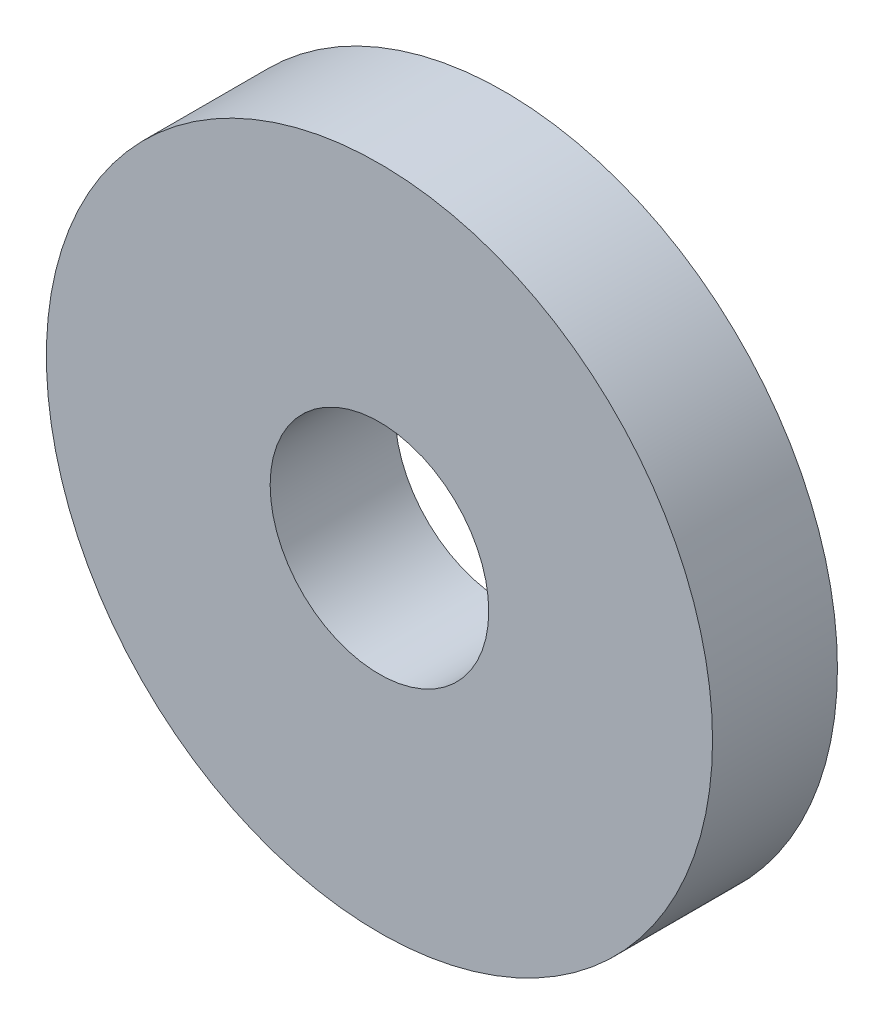
ISO-10303-21;
HEADER;
FILE_DESCRIPTION(('STEP AP214'),'2;1');
FILE_NAME('part.step','',(''),(''),'','','');
FILE_SCHEMA(('AUTOMOTIVE_DESIGN { 1 0 10303 214 1 1 1 1 }'));
ENDSEC;
DATA;
#1=APPLICATION_CONTEXT('core data for automotive mechanical design processes');
#2=APPLICATION_PROTOCOL_DEFINITION('international standard','automotive_design',2000,#1);
#3=PRODUCT_CONTEXT('',#1,'mechanical');
#4=PRODUCT('Part','Part','',(#3));
#5=PRODUCT_RELATED_PRODUCT_CATEGORY('part','',(#4));
#6=PRODUCT_DEFINITION_FORMATION('','',#4);
#7=PRODUCT_DEFINITION_CONTEXT('part definition',#1,'design');
#8=PRODUCT_DEFINITION('design','',#6,#7);
#9=PRODUCT_DEFINITION_SHAPE('','',#8);
#10=(LENGTH_UNIT() NAMED_UNIT(*) SI_UNIT(.MILLI.,.METRE.));
#11=(NAMED_UNIT(*) PLANE_ANGLE_UNIT() SI_UNIT($,.RADIAN.));
#12=(NAMED_UNIT(*) SI_UNIT($,.STERADIAN.) SOLID_ANGLE_UNIT());
#13=UNCERTAINTY_MEASURE_WITH_UNIT(LENGTH_MEASURE(1.E-05),#10,'distance_accuracy_value','');
#14=(GEOMETRIC_REPRESENTATION_CONTEXT(3) GLOBAL_UNCERTAINTY_ASSIGNED_CONTEXT((#13)) GLOBAL_UNIT_ASSIGNED_CONTEXT((#10,
#11,#12)) REPRESENTATION_CONTEXT('',''));
#15=CARTESIAN_POINT('',(0.,0.,0.));
#16=DIRECTION('',(0.,0.,1.));
#17=DIRECTION('',(1.,0.,0.));
#18=AXIS2_PLACEMENT_3D('',#15,#16,#17);
#19=CARTESIAN_POINT('',(0.,0.,6.));
#20=DIRECTION('',(0.,0.,1.));
#21=DIRECTION('',(1.,0.,0.));
#22=AXIS2_PLACEMENT_3D('',#19,#20,#21);
#23=PLANE('',#22);
#24=CARTESIAN_POINT('',(0.,0.,6.));
#25=DIRECTION('',(0.,0.,1.));
#26=DIRECTION('',(1.,0.,0.));
#27=AXIS2_PLACEMENT_3D('',#24,#25,#26);
#28=CIRCLE('',#27,16.);
#29=CARTESIAN_POINT('',(16.,0.,6.));
#30=VERTEX_POINT('',#29);
#31=EDGE_CURVE('E10',#30,#30,#28,.T.);
#32=ORIENTED_EDGE('',*,*,#31,.T.);
#33=EDGE_LOOP('',(#32));
#34=FACE_BOUND('',#33,.T.);
#35=CARTESIAN_POINT('',(0.,0.,6.));
#36=DIRECTION('',(0.,0.,1.));
#37=DIRECTION('',(1.,0.,0.));
#38=AXIS2_PLACEMENT_3D('',#35,#36,#37);
#39=CIRCLE('',#38,5.25);
#40=CARTESIAN_POINT('',(5.25,0.,6.));
#41=VERTEX_POINT('',#40);
#42=EDGE_CURVE('E44',#41,#41,#39,.T.);
#43=ORIENTED_EDGE('',*,*,#42,.F.);
#44=EDGE_LOOP('',(#43));
#45=FACE_BOUND('',#44,.T.);
#46=ADVANCED_FACE('F33',(#34,#45),#23,.T.);
#47=CARTESIAN_POINT('',(0.,0.,0.));
#48=DIRECTION('',(0.,0.,1.));
#49=DIRECTION('',(1.,0.,0.));
#50=AXIS2_PLACEMENT_3D('',#47,#48,#49);
#51=PLANE('',#50);
#52=CARTESIAN_POINT('',(0.,0.,0.));
#53=DIRECTION('',(0.,0.,1.));
#54=DIRECTION('',(1.,0.,0.));
#55=AXIS2_PLACEMENT_3D('',#52,#53,#54);
#56=CIRCLE('',#55,16.);
#57=CARTESIAN_POINT('',(16.,0.,0.));
#58=VERTEX_POINT('',#57);
#59=EDGE_CURVE('E37',#58,#58,#56,.T.);
#60=ORIENTED_EDGE('',*,*,#59,.F.);
#61=EDGE_LOOP('',(#60));
#62=FACE_BOUND('',#61,.T.);
#63=CARTESIAN_POINT('',(0.,0.,0.));
#64=DIRECTION('',(0.,0.,1.));
#65=DIRECTION('',(1.,0.,0.));
#66=AXIS2_PLACEMENT_3D('',#63,#64,#65);
#67=CIRCLE('',#66,5.25);
#68=CARTESIAN_POINT('',(5.25,0.,0.));
#69=VERTEX_POINT('',#68);
#70=EDGE_CURVE('E46',#69,#69,#67,.T.);
#71=ORIENTED_EDGE('',*,*,#70,.T.);
#72=EDGE_LOOP('',(#71));
#73=FACE_BOUND('',#72,.T.);
#74=ADVANCED_FACE('F56',(#62,#73),#51,.F.);
#75=CARTESIAN_POINT('',(0.,0.,6.));
#76=DIRECTION('',(0.,0.,-1.));
#77=DIRECTION('',(-1.,0.,0.));
#78=AXIS2_PLACEMENT_3D('',#75,#76,#77);
#79=CYLINDRICAL_SURFACE('',#78,16.);
#80=ORIENTED_EDGE('',*,*,#31,.F.);
#81=EDGE_LOOP('',(#80));
#82=FACE_BOUND('',#81,.T.);
#83=ORIENTED_EDGE('',*,*,#59,.T.);
#84=EDGE_LOOP('',(#83));
#85=FACE_BOUND('',#84,.T.);
#86=ADVANCED_FACE('F35',(#82,#85),#79,.T.);
#87=CARTESIAN_POINT('',(0.,0.,6.));
#88=DIRECTION('',(0.,0.,-1.));
#89=DIRECTION('',(-1.,0.,0.));
#90=AXIS2_PLACEMENT_3D('',#87,#88,#89);
#91=CYLINDRICAL_SURFACE('',#90,5.25);
#92=ORIENTED_EDGE('',*,*,#42,.T.);
#93=EDGE_LOOP('',(#92));
#94=FACE_BOUND('',#93,.T.);
#95=ORIENTED_EDGE('',*,*,#70,.F.);
#96=EDGE_LOOP('',(#95));
#97=FACE_BOUND('',#96,.T.);
#98=ADVANCED_FACE('F52',(#94,#97),#91,.F.);
#99=CLOSED_SHELL('',(#46,#74,#86,#98));
#100=MANIFOLD_SOLID_BREP('B2',#99);
#101=ADVANCED_BREP_SHAPE_REPRESENTATION('',(#18,#100),#14);
#102=SHAPE_DEFINITION_REPRESENTATION(#9,#101);
ENDSEC;
END-ISO-10303-21;
